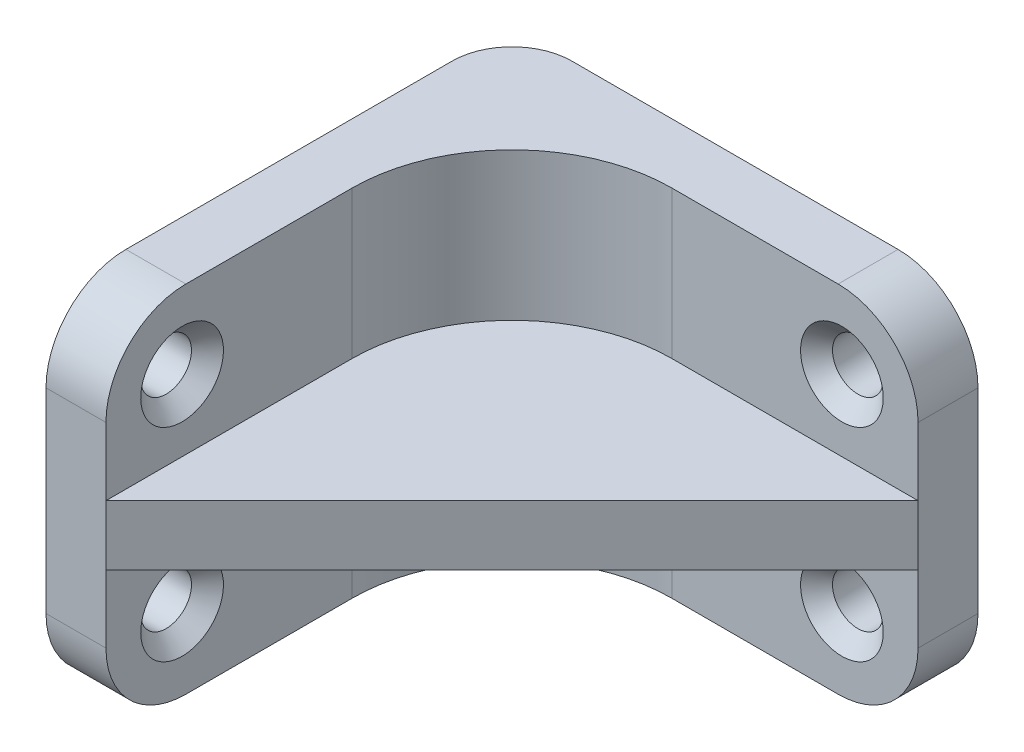
ISO-10303-21;
HEADER;
FILE_DESCRIPTION(('STEP AP214'),'2;1');
FILE_NAME('part.step','',(''),(''),'','','');
FILE_SCHEMA(('AUTOMOTIVE_DESIGN { 1 0 10303 214 1 1 1 1 }'));
ENDSEC;
DATA;
#1=APPLICATION_CONTEXT('core data for automotive mechanical design processes');
#2=APPLICATION_PROTOCOL_DEFINITION('international standard','automotive_design',2000,#1);
#3=PRODUCT_CONTEXT('',#1,'mechanical');
#4=PRODUCT('Part','Part','',(#3));
#5=PRODUCT_RELATED_PRODUCT_CATEGORY('part','',(#4));
#6=PRODUCT_DEFINITION_FORMATION('','',#4);
#7=PRODUCT_DEFINITION_CONTEXT('part definition',#1,'design');
#8=PRODUCT_DEFINITION('design','',#6,#7);
#9=PRODUCT_DEFINITION_SHAPE('','',#8);
#10=(LENGTH_UNIT() NAMED_UNIT(*) SI_UNIT(.MILLI.,.METRE.));
#11=(NAMED_UNIT(*) PLANE_ANGLE_UNIT() SI_UNIT($,.RADIAN.));
#12=(NAMED_UNIT(*) SI_UNIT($,.STERADIAN.) SOLID_ANGLE_UNIT());
#13=UNCERTAINTY_MEASURE_WITH_UNIT(LENGTH_MEASURE(1.E-05),#10,'distance_accuracy_value','');
#14=(GEOMETRIC_REPRESENTATION_CONTEXT(3) GLOBAL_UNCERTAINTY_ASSIGNED_CONTEXT((#13)) GLOBAL_UNIT_ASSIGNED_CONTEXT((#10,
#11,#12)) REPRESENTATION_CONTEXT('',''));
#15=CARTESIAN_POINT('',(0.,0.,0.));
#16=DIRECTION('',(0.,0.,1.));
#17=DIRECTION('',(1.,0.,0.));
#18=AXIS2_PLACEMENT_3D('',#15,#16,#17);
#19=CARTESIAN_POINT('',(-0.475,-0.474999999999998,7.5));
#20=DIRECTION('',(0.,0.,-1.));
#21=DIRECTION('',(-1.,0.,0.));
#22=AXIS2_PLACEMENT_3D('',#19,#20,#21);
#23=PLANE('',#22);
#24=CARTESIAN_POINT('',(0.,-25.4,7.5));
#25=DIRECTION('',(0.,0.,-1.));
#26=DIRECTION('',(-1.,0.,0.));
#27=AXIS2_PLACEMENT_3D('',#24,#25,#26);
#28=CIRCLE('',#27,5.17500000000001);
#29=CARTESIAN_POINT('',(-5.17500000000001,-25.4,7.5));
#30=VERTEX_POINT('',#29);
#31=EDGE_CURVE('E284',#30,#30,#28,.T.);
#32=ORIENTED_EDGE('',*,*,#31,.T.);
#33=EDGE_LOOP('',(#32));
#34=FACE_BOUND('',#33,.T.);
#35=DIRECTION('',(-1.,0.,0.));
#36=VECTOR('',#35,1.);
#37=CARTESIAN_POINT('',(-0.475000000000068,-16.45,7.5));
#38=LINE('',#37,#36);
#39=CARTESIAN_POINT('',(9.525,-16.45,7.5));
#40=VERTEX_POINT('',#39);
#41=CARTESIAN_POINT('',(-21.275,-16.45,7.5));
#42=VERTEX_POINT('',#41);
#43=EDGE_CURVE('E161',#40,#42,#38,.T.);
#44=ORIENTED_EDGE('',*,*,#43,.T.);
#45=DIRECTION('',(0.,-1.,0.));
#46=VECTOR('',#45,1.);
#47=CARTESIAN_POINT('',(-21.275,-0.475000000000001,7.5));
#48=LINE('',#47,#46);
#49=CARTESIAN_POINT('',(-21.275,-34.925,7.5));
#50=VERTEX_POINT('',#49);
#51=EDGE_CURVE('E147',#42,#50,#48,.T.);
#52=ORIENTED_EDGE('',*,*,#51,.T.);
#53=DIRECTION('',(1.,0.,0.));
#54=VECTOR('',#53,1.);
#55=CARTESIAN_POINT('',(-0.475000000000069,-34.925,7.5));
#56=LINE('',#55,#54);
#57=CARTESIAN_POINT('',(-0.475000000000067,-34.925,7.5));
#58=VERTEX_POINT('',#57);
#59=EDGE_CURVE('E239',#50,#58,#56,.T.);
#60=ORIENTED_EDGE('',*,*,#59,.T.);
#61=CARTESIAN_POINT('',(-0.474999999999998,-24.925,7.5));
#62=DIRECTION('',(0.,0.,1.));
#63=DIRECTION('',(-1.,0.,0.));
#64=AXIS2_PLACEMENT_3D('',#61,#62,#63);
#65=CIRCLE('',#64,10.);
#66=CARTESIAN_POINT('',(9.525,-24.9249999999999,7.5));
#67=VERTEX_POINT('',#66);
#68=EDGE_CURVE('E241',#58,#67,#65,.T.);
#69=ORIENTED_EDGE('',*,*,#68,.T.);
#70=DIRECTION('',(0.,1.,0.));
#71=VECTOR('',#70,1.);
#72=CARTESIAN_POINT('',(9.525,-0.475000000000069,7.5));
#73=LINE('',#72,#71);
#74=EDGE_CURVE('E162',#67,#40,#73,.T.);
#75=ORIENTED_EDGE('',*,*,#74,.T.);
#76=EDGE_LOOP('',(#44,#52,#60,#69,#75));
#77=FACE_BOUND('',#76,.T.);
#78=ADVANCED_FACE('F33',(#34,#77),#23,.F.);
#79=CARTESIAN_POINT('',(-41.275,-0.47500000000022,48.3));
#80=DIRECTION('',(1.,0.,0.));
#81=DIRECTION('',(0.,1.,0.));
#82=AXIS2_PLACEMENT_3D('',#79,#80,#81);
#83=PLANE('',#82);
#84=CARTESIAN_POINT('',(-41.275,-25.4,48.775));
#85=DIRECTION('',(1.,0.,0.));
#86=DIRECTION('',(0.,1.,0.));
#87=AXIS2_PLACEMENT_3D('',#84,#85,#86);
#88=CIRCLE('',#87,5.17500000000001);
#89=CARTESIAN_POINT('',(-41.275,-20.225,48.775));
#90=VERTEX_POINT('',#89);
#91=EDGE_CURVE('E41',#90,#90,#88,.F.);
#92=ORIENTED_EDGE('',*,*,#91,.T.);
#93=EDGE_LOOP('',(#92));
#94=FACE_BOUND('',#93,.T.);
#95=DIRECTION('',(0.,-1.,0.));
#96=VECTOR('',#95,1.);
#97=CARTESIAN_POINT('',(-41.275,-0.47500000000022,27.5));
#98=LINE('',#97,#96);
#99=CARTESIAN_POINT('',(-41.275,-34.925,27.5));
#100=VERTEX_POINT('',#99);
#101=CARTESIAN_POINT('',(-41.275,-16.45,27.5));
#102=VERTEX_POINT('',#101);
#103=EDGE_CURVE('E276',#100,#102,#98,.F.);
#104=ORIENTED_EDGE('',*,*,#103,.T.);
#105=DIRECTION('',(0.,0.,1.));
#106=VECTOR('',#105,1.);
#107=CARTESIAN_POINT('',(-41.275,-16.45,58.3000000000002));
#108=LINE('',#107,#106);
#109=CARTESIAN_POINT('',(-41.275,-16.45,58.3000000000002));
#110=VERTEX_POINT('',#109);
#111=EDGE_CURVE('E170',#102,#110,#108,.T.);
#112=ORIENTED_EDGE('',*,*,#111,.T.);
#113=DIRECTION('',(0.,1.,0.));
#114=VECTOR('',#113,1.);
#115=CARTESIAN_POINT('',(-41.275,-0.475000000000218,58.3000000000002));
#116=LINE('',#115,#114);
#117=CARTESIAN_POINT('',(-41.275,-24.925,58.3000000000002));
#118=VERTEX_POINT('',#117);
#119=EDGE_CURVE('E206',#118,#110,#116,.T.);
#120=ORIENTED_EDGE('',*,*,#119,.F.);
#121=CARTESIAN_POINT('',(-41.275,-24.925,48.3000000000002));
#122=DIRECTION('',(-1.,0.,0.));
#123=DIRECTION('',(0.,1.,0.));
#124=AXIS2_PLACEMENT_3D('',#121,#122,#123);
#125=CIRCLE('',#124,10.);
#126=CARTESIAN_POINT('',(-41.275,-34.925,48.3000000000002));
#127=VERTEX_POINT('',#126);
#128=EDGE_CURVE('E203',#127,#118,#125,.T.);
#129=ORIENTED_EDGE('',*,*,#128,.F.);
#130=DIRECTION('',(0.,0.,1.));
#131=VECTOR('',#130,1.);
#132=CARTESIAN_POINT('',(-41.275,-34.925,48.3000000000002));
#133=LINE('',#132,#131);
#134=EDGE_CURVE('E188',#100,#127,#133,.T.);
#135=ORIENTED_EDGE('',*,*,#134,.F.);
#136=EDGE_LOOP('',(#104,#112,#120,#129,#135));
#137=FACE_BOUND('',#136,.T.);
#138=ADVANCED_FACE('F301',(#94,#137),#83,.T.);
#139=CARTESIAN_POINT('',(-21.275,-0.475000000000001,27.5));
#140=DIRECTION('',(0.,-1.,0.));
#141=DIRECTION('',(1.,0.,0.));
#142=AXIS2_PLACEMENT_3D('',#139,#140,#141);
#143=CYLINDRICAL_SURFACE('',#142,20.);
#144=CARTESIAN_POINT('',(-21.275,-16.45,27.5));
#145=DIRECTION('',(0.,1.,0.));
#146=DIRECTION('',(-1.,0.,0.));
#147=AXIS2_PLACEMENT_3D('',#144,#145,#146);
#148=CIRCLE('',#147,20.);
#149=EDGE_CURVE('E152',#42,#102,#148,.T.);
#150=ORIENTED_EDGE('',*,*,#149,.T.);
#151=ORIENTED_EDGE('',*,*,#103,.F.);
#152=CARTESIAN_POINT('',(-21.275,-34.925,27.5));
#153=DIRECTION('',(0.,1.,0.));
#154=DIRECTION('',(0.,0.,1.));
#155=AXIS2_PLACEMENT_3D('',#152,#153,#154);
#156=CIRCLE('',#155,20.);
#157=EDGE_CURVE('E154',#50,#100,#156,.T.);
#158=ORIENTED_EDGE('',*,*,#157,.F.);
#159=ORIENTED_EDGE('',*,*,#51,.F.);
#160=EDGE_LOOP('',(#150,#151,#158,#159));
#161=FACE_BOUND('',#160,.T.);
#162=ADVANCED_FACE('F149',(#161),#143,.F.);
#163=CARTESIAN_POINT('',(0.,0.,7.5));
#164=DIRECTION('',(0.,0.,-1.));
#165=DIRECTION('',(-1.,0.,0.));
#166=AXIS2_PLACEMENT_3D('',#163,#164,#165);
#167=CIRCLE('',#166,5.17500000000001);
#168=CARTESIAN_POINT('',(-5.17500000000001,0.,7.5));
#169=VERTEX_POINT('',#168);
#170=EDGE_CURVE('E290',#169,#169,#167,.T.);
#171=ORIENTED_EDGE('',*,*,#170,.T.);
#172=EDGE_LOOP('',(#171));
#173=FACE_BOUND('',#172,.T.);
#174=CARTESIAN_POINT('',(-21.275,9.525,7.5));
#175=VERTEX_POINT('',#174);
#176=CARTESIAN_POINT('',(-21.275,-8.95,7.5));
#177=VERTEX_POINT('',#176);
#178=EDGE_CURVE('E157',#175,#177,#48,.T.);
#179=ORIENTED_EDGE('',*,*,#178,.T.);
#180=DIRECTION('',(-1.,0.,0.));
#181=VECTOR('',#180,1.);
#182=CARTESIAN_POINT('',(-21.275,-8.95,7.5));
#183=LINE('',#182,#181);
#184=CARTESIAN_POINT('',(9.525,-8.95,7.5));
#185=VERTEX_POINT('',#184);
#186=EDGE_CURVE('E48',#185,#177,#183,.T.);
#187=ORIENTED_EDGE('',*,*,#186,.F.);
#188=CARTESIAN_POINT('',(9.525,-0.475000000000068,7.5));
#189=VERTEX_POINT('',#188);
#190=EDGE_CURVE('E244',#185,#189,#73,.T.);
#191=ORIENTED_EDGE('',*,*,#190,.T.);
#192=CARTESIAN_POINT('',(-0.475,-0.474999999999998,7.5));
#193=DIRECTION('',(0.,0.,1.));
#194=DIRECTION('',(-1.,0.,0.));
#195=AXIS2_PLACEMENT_3D('',#192,#193,#194);
#196=CIRCLE('',#195,10.);
#197=CARTESIAN_POINT('',(-0.475000000000074,9.525,7.5));
#198=VERTEX_POINT('',#197);
#199=EDGE_CURVE('E246',#189,#198,#196,.T.);
#200=ORIENTED_EDGE('',*,*,#199,.T.);
#201=DIRECTION('',(-1.,0.,0.));
#202=VECTOR('',#201,1.);
#203=CARTESIAN_POINT('',(-41.275,9.525,7.5));
#204=LINE('',#203,#202);
#205=EDGE_CURVE('E248',#198,#175,#204,.T.);
#206=ORIENTED_EDGE('',*,*,#205,.T.);
#207=EDGE_LOOP('',(#179,#187,#191,#200,#206));
#208=FACE_BOUND('',#207,.T.);
#209=ADVANCED_FACE('F316',(#173,#208),#23,.F.);
#210=CARTESIAN_POINT('',(-0.475,-0.474999999999998,0.));
#211=DIRECTION('',(0.,0.,-1.));
#212=DIRECTION('',(-1.,0.,0.));
#213=AXIS2_PLACEMENT_3D('',#210,#211,#212);
#214=PLANE('',#213);
#215=CARTESIAN_POINT('',(0.,0.,0.));
#216=DIRECTION('',(0.,0.,1.));
#217=DIRECTION('',(1.,0.,0.));
#218=AXIS2_PLACEMENT_3D('',#215,#216,#217);
#219=CIRCLE('',#218,3.175);
#220=CARTESIAN_POINT('',(3.175,0.,0.));
#221=VERTEX_POINT('',#220);
#222=EDGE_CURVE('E235',#221,#221,#219,.T.);
#223=ORIENTED_EDGE('',*,*,#222,.T.);
#224=EDGE_LOOP('',(#223));
#225=FACE_BOUND('',#224,.T.);
#226=DIRECTION('',(1.,0.,0.));
#227=VECTOR('',#226,1.);
#228=CARTESIAN_POINT('',(-0.475000000000069,-34.925,0.));
#229=LINE('',#228,#227);
#230=CARTESIAN_POINT('',(-41.275,-34.925,0.));
#231=VERTEX_POINT('',#230);
#232=CARTESIAN_POINT('',(-0.475000000000067,-34.925,0.));
#233=VERTEX_POINT('',#232);
#234=EDGE_CURVE('E238',#231,#233,#229,.T.);
#235=ORIENTED_EDGE('',*,*,#234,.F.);
#236=DIRECTION('',(0.,-1.,0.));
#237=VECTOR('',#236,1.);
#238=CARTESIAN_POINT('',(-41.275,9.525,0.));
#239=LINE('',#238,#237);
#240=CARTESIAN_POINT('',(-41.275,9.52500000000001,0.));
#241=VERTEX_POINT('',#240);
#242=EDGE_CURVE('E242',#241,#231,#239,.T.);
#243=ORIENTED_EDGE('',*,*,#242,.F.);
#244=DIRECTION('',(-1.,0.,0.));
#245=VECTOR('',#244,1.);
#246=CARTESIAN_POINT('',(-41.275,9.525,0.));
#247=LINE('',#246,#245);
#248=CARTESIAN_POINT('',(-0.475000000000074,9.525,0.));
#249=VERTEX_POINT('',#248);
#250=EDGE_CURVE('E260',#249,#241,#247,.T.);
#251=ORIENTED_EDGE('',*,*,#250,.F.);
#252=CARTESIAN_POINT('',(-0.475,-0.474999999999998,0.));
#253=DIRECTION('',(0.,0.,1.));
#254=DIRECTION('',(-1.,0.,0.));
#255=AXIS2_PLACEMENT_3D('',#252,#253,#254);
#256=CIRCLE('',#255,10.);
#257=CARTESIAN_POINT('',(9.525,-0.475000000000068,0.));
#258=VERTEX_POINT('',#257);
#259=EDGE_CURVE('E258',#258,#249,#256,.T.);
#260=ORIENTED_EDGE('',*,*,#259,.F.);
#261=DIRECTION('',(0.,1.,0.));
#262=VECTOR('',#261,1.);
#263=CARTESIAN_POINT('',(9.525,-0.475000000000069,0.));
#264=LINE('',#263,#262);
#265=CARTESIAN_POINT('',(9.525,-24.9249999999999,0.));
#266=VERTEX_POINT('',#265);
#267=EDGE_CURVE('E256',#266,#258,#264,.T.);
#268=ORIENTED_EDGE('',*,*,#267,.F.);
#269=CARTESIAN_POINT('',(-0.474999999999998,-24.925,0.));
#270=DIRECTION('',(0.,0.,1.));
#271=DIRECTION('',(-1.,0.,0.));
#272=AXIS2_PLACEMENT_3D('',#269,#270,#271);
#273=CIRCLE('',#272,10.);
#274=EDGE_CURVE('E254',#233,#266,#273,.T.);
#275=ORIENTED_EDGE('',*,*,#274,.F.);
#276=EDGE_LOOP('',(#235,#243,#251,#260,#268,#275));
#277=FACE_BOUND('',#276,.T.);
#278=CARTESIAN_POINT('',(0.,-25.4,0.));
#279=DIRECTION('',(0.,0.,1.));
#280=DIRECTION('',(-1.,0.,0.));
#281=AXIS2_PLACEMENT_3D('',#278,#279,#280);
#282=CIRCLE('',#281,3.175);
#283=CARTESIAN_POINT('',(-3.175,-25.4,0.));
#284=VERTEX_POINT('',#283);
#285=EDGE_CURVE('E228',#284,#284,#282,.T.);
#286=ORIENTED_EDGE('',*,*,#285,.T.);
#287=EDGE_LOOP('',(#286));
#288=FACE_BOUND('',#287,.T.);
#289=ADVANCED_FACE('F325',(#225,#277,#288),#214,.T.);
#290=CARTESIAN_POINT('',(-0.475000000000069,-34.925,7.5));
#291=DIRECTION('',(0.,1.,0.));
#292=DIRECTION('',(0.,0.,1.));
#293=AXIS2_PLACEMENT_3D('',#290,#291,#292);
#294=PLANE('',#293);
#295=ORIENTED_EDGE('',*,*,#234,.T.);
#296=DIRECTION('',(0.,0.,-1.));
#297=VECTOR('',#296,1.);
#298=CARTESIAN_POINT('',(-0.475000000000067,-34.925,7.5));
#299=LINE('',#298,#297);
#300=EDGE_CURVE('E158',#58,#233,#299,.T.);
#301=ORIENTED_EDGE('',*,*,#300,.F.);
#302=ORIENTED_EDGE('',*,*,#59,.F.);
#303=ORIENTED_EDGE('',*,*,#157,.T.);
#304=ORIENTED_EDGE('',*,*,#134,.T.);
#305=DIRECTION('',(1.,0.,0.));
#306=VECTOR('',#305,1.);
#307=CARTESIAN_POINT('',(-48.775,-34.925,48.3000000000002));
#308=LINE('',#307,#306);
#309=CARTESIAN_POINT('',(-48.775,-34.925,48.3000000000002));
#310=VERTEX_POINT('',#309);
#311=EDGE_CURVE('E221',#310,#127,#308,.T.);
#312=ORIENTED_EDGE('',*,*,#311,.F.);
#313=DIRECTION('',(0.,0.,1.));
#314=VECTOR('',#313,1.);
#315=CARTESIAN_POINT('',(-48.775,-34.925,48.3000000000002));
#316=LINE('',#315,#314);
#317=CARTESIAN_POINT('',(-48.775,-34.925,7.50000000000001));
#318=VERTEX_POINT('',#317);
#319=EDGE_CURVE('E189',#318,#310,#316,.T.);
#320=ORIENTED_EDGE('',*,*,#319,.F.);
#321=CARTESIAN_POINT('',(-41.275,-34.925,7.5));
#322=DIRECTION('',(0.,-1.,0.));
#323=DIRECTION('',(0.,0.,-1.));
#324=AXIS2_PLACEMENT_3D('',#321,#322,#323);
#325=CIRCLE('',#324,7.5);
#326=EDGE_CURVE('E224',#318,#231,#325,.T.);
#327=ORIENTED_EDGE('',*,*,#326,.T.);
#328=EDGE_LOOP('',(#295,#301,#302,#303,#304,#312,#320,#327));
#329=FACE_BOUND('',#328,.T.);
#330=ADVANCED_FACE('F331',(#329),#294,.F.);
#331=CARTESIAN_POINT('',(-0.474999999999998,-24.925,7.5));
#332=DIRECTION('',(0.,0.,-1.));
#333=DIRECTION('',(-1.,0.,0.));
#334=AXIS2_PLACEMENT_3D('',#331,#332,#333);
#335=CYLINDRICAL_SURFACE('',#334,10.);
#336=ORIENTED_EDGE('',*,*,#274,.T.);
#337=DIRECTION('',(0.,0.,-1.));
#338=VECTOR('',#337,1.);
#339=CARTESIAN_POINT('',(9.525,-24.9249999999999,7.5));
#340=LINE('',#339,#338);
#341=EDGE_CURVE('E270',#67,#266,#340,.T.);
#342=ORIENTED_EDGE('',*,*,#341,.F.);
#343=ORIENTED_EDGE('',*,*,#68,.F.);
#344=ORIENTED_EDGE('',*,*,#300,.T.);
#345=EDGE_LOOP('',(#336,#342,#343,#344));
#346=FACE_BOUND('',#345,.T.);
#347=ADVANCED_FACE('F370',(#346),#335,.T.);
#348=CARTESIAN_POINT('',(9.525,-0.475000000000069,7.5));
#349=DIRECTION('',(-1.,0.,0.));
#350=DIRECTION('',(0.,-1.,0.));
#351=AXIS2_PLACEMENT_3D('',#348,#349,#350);
#352=PLANE('',#351);
#353=ORIENTED_EDGE('',*,*,#267,.T.);
#354=DIRECTION('',(0.,0.,-1.));
#355=VECTOR('',#354,1.);
#356=CARTESIAN_POINT('',(9.525,-0.475000000000068,7.5));
#357=LINE('',#356,#355);
#358=EDGE_CURVE('E267',#189,#258,#357,.T.);
#359=ORIENTED_EDGE('',*,*,#358,.F.);
#360=ORIENTED_EDGE('',*,*,#190,.F.);
#361=DIRECTION('',(0.,-1.,0.));
#362=VECTOR('',#361,1.);
#363=CARTESIAN_POINT('',(9.525,-8.95,7.5));
#364=LINE('',#363,#362);
#365=EDGE_CURVE('E55',#185,#40,#364,.T.);
#366=ORIENTED_EDGE('',*,*,#365,.T.);
#367=ORIENTED_EDGE('',*,*,#74,.F.);
#368=ORIENTED_EDGE('',*,*,#341,.T.);
#369=EDGE_LOOP('',(#353,#359,#360,#366,#367,#368));
#370=FACE_BOUND('',#369,.T.);
#371=ADVANCED_FACE('F372',(#370),#352,.F.);
#372=CARTESIAN_POINT('',(-0.475,-0.474999999999998,7.5));
#373=DIRECTION('',(0.,0.,-1.));
#374=DIRECTION('',(-1.,0.,0.));
#375=AXIS2_PLACEMENT_3D('',#372,#373,#374);
#376=CYLINDRICAL_SURFACE('',#375,10.);
#377=ORIENTED_EDGE('',*,*,#259,.T.);
#378=DIRECTION('',(0.,0.,-1.));
#379=VECTOR('',#378,1.);
#380=CARTESIAN_POINT('',(-0.475000000000074,9.525,7.5));
#381=LINE('',#380,#379);
#382=EDGE_CURVE('E251',#198,#249,#381,.T.);
#383=ORIENTED_EDGE('',*,*,#382,.F.);
#384=ORIENTED_EDGE('',*,*,#199,.F.);
#385=ORIENTED_EDGE('',*,*,#358,.T.);
#386=EDGE_LOOP('',(#377,#383,#384,#385));
#387=FACE_BOUND('',#386,.T.);
#388=ADVANCED_FACE('F375',(#387),#376,.T.);
#389=CARTESIAN_POINT('',(-41.275,9.525,7.5));
#390=DIRECTION('',(0.,-1.,0.));
#391=DIRECTION('',(1.,0.,0.));
#392=AXIS2_PLACEMENT_3D('',#389,#390,#391);
#393=PLANE('',#392);
#394=ORIENTED_EDGE('',*,*,#250,.T.);
#395=CARTESIAN_POINT('',(-41.275,9.52500000000001,7.5));
#396=DIRECTION('',(0.,-1.,0.));
#397=DIRECTION('',(1.,0.,0.));
#398=AXIS2_PLACEMENT_3D('',#395,#396,#397);
#399=CIRCLE('',#398,7.5);
#400=CARTESIAN_POINT('',(-48.775,9.52500000000001,7.5));
#401=VERTEX_POINT('',#400);
#402=EDGE_CURVE('E225',#241,#401,#399,.F.);
#403=ORIENTED_EDGE('',*,*,#402,.T.);
#404=DIRECTION('',(0.,0.,-1.));
#405=VECTOR('',#404,1.);
#406=CARTESIAN_POINT('',(-48.775,9.52500000000001,7.5));
#407=LINE('',#406,#405);
#408=CARTESIAN_POINT('',(-48.775,9.52500000000001,48.3));
#409=VERTEX_POINT('',#408);
#410=EDGE_CURVE('E199',#409,#401,#407,.T.);
#411=ORIENTED_EDGE('',*,*,#410,.F.);
#412=DIRECTION('',(1.,0.,0.));
#413=VECTOR('',#412,1.);
#414=CARTESIAN_POINT('',(-48.775,9.52500000000001,48.3));
#415=LINE('',#414,#413);
#416=CARTESIAN_POINT('',(-41.275,9.52500000000001,48.3));
#417=VERTEX_POINT('',#416);
#418=EDGE_CURVE('E201',#409,#417,#415,.T.);
#419=ORIENTED_EDGE('',*,*,#418,.T.);
#420=DIRECTION('',(0.,0.,-1.));
#421=VECTOR('',#420,1.);
#422=CARTESIAN_POINT('',(-41.275,9.52500000000001,7.5));
#423=LINE('',#422,#421);
#424=CARTESIAN_POINT('',(-41.275,9.52500000000001,27.5));
#425=VERTEX_POINT('',#424);
#426=EDGE_CURVE('E193',#417,#425,#423,.T.);
#427=ORIENTED_EDGE('',*,*,#426,.T.);
#428=CARTESIAN_POINT('',(-21.275,9.525,27.5));
#429=DIRECTION('',(0.,-1.,0.));
#430=DIRECTION('',(1.,0.,0.));
#431=AXIS2_PLACEMENT_3D('',#428,#429,#430);
#432=CIRCLE('',#431,20.);
#433=EDGE_CURVE('E279',#425,#175,#432,.T.);
#434=ORIENTED_EDGE('',*,*,#433,.T.);
#435=ORIENTED_EDGE('',*,*,#205,.F.);
#436=ORIENTED_EDGE('',*,*,#382,.T.);
#437=EDGE_LOOP('',(#394,#403,#411,#419,#427,#434,#435,#436));
#438=FACE_BOUND('',#437,.T.);
#439=ADVANCED_FACE('F381',(#438),#393,.F.);
#440=CARTESIAN_POINT('',(0.,0.,7.5));
#441=DIRECTION('',(0.,0.,-1.));
#442=DIRECTION('',(-1.,0.,0.));
#443=AXIS2_PLACEMENT_3D('',#440,#441,#442);
#444=CYLINDRICAL_SURFACE('',#443,3.175);
#445=CARTESIAN_POINT('',(0.,0.,5.49999999999999));
#446=DIRECTION('',(0.,0.,-1.));
#447=DIRECTION('',(-1.,0.,0.));
#448=AXIS2_PLACEMENT_3D('',#445,#446,#447);
#449=CIRCLE('',#448,3.175);
#450=CARTESIAN_POINT('',(-3.175,0.,5.49999999999999));
#451=VERTEX_POINT('',#450);
#452=EDGE_CURVE('E287',#451,#451,#449,.F.);
#453=ORIENTED_EDGE('',*,*,#452,.T.);
#454=EDGE_LOOP('',(#453));
#455=FACE_BOUND('',#454,.T.);
#456=ORIENTED_EDGE('',*,*,#222,.F.);
#457=EDGE_LOOP('',(#456));
#458=FACE_BOUND('',#457,.T.);
#459=ADVANCED_FACE('F402',(#455,#458),#444,.F.);
#460=CARTESIAN_POINT('',(0.,-25.4,7.5));
#461=DIRECTION('',(0.,0.,-1.));
#462=DIRECTION('',(-1.,0.,0.));
#463=AXIS2_PLACEMENT_3D('',#460,#461,#462);
#464=CYLINDRICAL_SURFACE('',#463,3.175);
#465=CARTESIAN_POINT('',(0.,-25.4,5.49999999999999));
#466=DIRECTION('',(0.,0.,-1.));
#467=DIRECTION('',(-1.,0.,0.));
#468=AXIS2_PLACEMENT_3D('',#465,#466,#467);
#469=CIRCLE('',#468,3.175);
#470=CARTESIAN_POINT('',(-3.175,-25.4,5.49999999999999));
#471=VERTEX_POINT('',#470);
#472=EDGE_CURVE('E281',#471,#471,#469,.F.);
#473=ORIENTED_EDGE('',*,*,#472,.T.);
#474=EDGE_LOOP('',(#473));
#475=FACE_BOUND('',#474,.T.);
#476=ORIENTED_EDGE('',*,*,#285,.F.);
#477=EDGE_LOOP('',(#476));
#478=FACE_BOUND('',#477,.T.);
#479=ADVANCED_FACE('F405',(#475,#478),#464,.F.);
#480=CARTESIAN_POINT('',(-41.275,20.1316017177982,7.5));
#481=DIRECTION('',(0.,-1.,0.));
#482=DIRECTION('',(0.,0.,-1.));
#483=AXIS2_PLACEMENT_3D('',#480,#481,#482);
#484=CYLINDRICAL_SURFACE('',#483,7.5);
#485=ORIENTED_EDGE('',*,*,#402,.F.);
#486=ORIENTED_EDGE('',*,*,#242,.T.);
#487=ORIENTED_EDGE('',*,*,#326,.F.);
#488=DIRECTION('',(0.,-1.,0.));
#489=VECTOR('',#488,1.);
#490=CARTESIAN_POINT('',(-48.775,20.1316017177982,7.50000000000001));
#491=LINE('',#490,#489);
#492=EDGE_CURVE('E229',#401,#318,#491,.T.);
#493=ORIENTED_EDGE('',*,*,#492,.F.);
#494=EDGE_LOOP('',(#485,#486,#487,#493));
#495=FACE_BOUND('',#494,.T.);
#496=ADVANCED_FACE('F412',(#495),#484,.T.);
#497=CARTESIAN_POINT('',(-48.775,-0.475000000000221,48.3));
#498=DIRECTION('',(1.,0.,0.));
#499=DIRECTION('',(0.,1.,0.));
#500=AXIS2_PLACEMENT_3D('',#497,#498,#499);
#501=PLANE('',#500);
#502=ORIENTED_EDGE('',*,*,#319,.T.);
#503=CARTESIAN_POINT('',(-48.775,-24.925,48.3000000000002));
#504=DIRECTION('',(-1.,0.,0.));
#505=DIRECTION('',(0.,1.,0.));
#506=AXIS2_PLACEMENT_3D('',#503,#504,#505);
#507=CIRCLE('',#506,10.);
#508=CARTESIAN_POINT('',(-48.775,-24.925,58.3000000000002));
#509=VERTEX_POINT('',#508);
#510=EDGE_CURVE('E192',#310,#509,#507,.T.);
#511=ORIENTED_EDGE('',*,*,#510,.T.);
#512=DIRECTION('',(0.,1.,0.));
#513=VECTOR('',#512,1.);
#514=CARTESIAN_POINT('',(-48.775,-0.475000000000219,58.3000000000002));
#515=LINE('',#514,#513);
#516=CARTESIAN_POINT('',(-48.775,-0.475000000000218,58.3000000000002));
#517=VERTEX_POINT('',#516);
#518=EDGE_CURVE('E195',#509,#517,#515,.T.);
#519=ORIENTED_EDGE('',*,*,#518,.T.);
#520=CARTESIAN_POINT('',(-48.775,-0.475000000000221,48.3));
#521=DIRECTION('',(-1.,0.,0.));
#522=DIRECTION('',(0.,1.,0.));
#523=AXIS2_PLACEMENT_3D('',#520,#521,#522);
#524=CIRCLE('',#523,10.0000000000002);
#525=EDGE_CURVE('E197',#517,#409,#524,.T.);
#526=ORIENTED_EDGE('',*,*,#525,.T.);
#527=ORIENTED_EDGE('',*,*,#410,.T.);
#528=ORIENTED_EDGE('',*,*,#492,.T.);
#529=EDGE_LOOP('',(#502,#511,#519,#526,#527,#528));
#530=FACE_BOUND('',#529,.T.);
#531=CARTESIAN_POINT('',(-48.775,0.,48.775));
#532=DIRECTION('',(-1.,0.,0.));
#533=DIRECTION('',(0.,-1.,0.));
#534=AXIS2_PLACEMENT_3D('',#531,#532,#533);
#535=CIRCLE('',#534,3.17500000000001);
#536=CARTESIAN_POINT('',(-48.775,-3.175,48.775));
#537=VERTEX_POINT('',#536);
#538=EDGE_CURVE('E185',#537,#537,#535,.T.);
#539=ORIENTED_EDGE('',*,*,#538,.F.);
#540=EDGE_LOOP('',(#539));
#541=FACE_BOUND('',#540,.T.);
#542=CARTESIAN_POINT('',(-48.775,-25.4,48.775));
#543=DIRECTION('',(-1.,0.,0.));
#544=DIRECTION('',(0.,1.,0.));
#545=AXIS2_PLACEMENT_3D('',#542,#543,#544);
#546=CIRCLE('',#545,3.175);
#547=CARTESIAN_POINT('',(-48.775,-22.225,48.775));
#548=VERTEX_POINT('',#547);
#549=EDGE_CURVE('E182',#548,#548,#546,.T.);
#550=ORIENTED_EDGE('',*,*,#549,.F.);
#551=EDGE_LOOP('',(#550));
#552=FACE_BOUND('',#551,.T.);
#553=ADVANCED_FACE('F418',(#530,#541,#552),#501,.F.);
#554=CARTESIAN_POINT('',(-41.275,0.,48.775));
#555=DIRECTION('',(1.,0.,0.));
#556=DIRECTION('',(0.,1.,0.));
#557=AXIS2_PLACEMENT_3D('',#554,#555,#556);
#558=CIRCLE('',#557,5.17499999999998);
#559=CARTESIAN_POINT('',(-41.275,5.17499999999999,48.775));
#560=VERTEX_POINT('',#559);
#561=EDGE_CURVE('E293',#560,#560,#558,.F.);
#562=ORIENTED_EDGE('',*,*,#561,.T.);
#563=EDGE_LOOP('',(#562));
#564=FACE_BOUND('',#563,.T.);
#565=DIRECTION('',(0.,0.,1.));
#566=VECTOR('',#565,1.);
#567=CARTESIAN_POINT('',(-41.275,-8.95,27.5));
#568=LINE('',#567,#566);
#569=CARTESIAN_POINT('',(-41.275,-8.95,27.5));
#570=VERTEX_POINT('',#569);
#571=CARTESIAN_POINT('',(-41.275,-8.95,58.3000000000002));
#572=VERTEX_POINT('',#571);
#573=EDGE_CURVE('E348',#570,#572,#568,.T.);
#574=ORIENTED_EDGE('',*,*,#573,.F.);
#575=EDGE_CURVE('E275',#570,#425,#98,.F.);
#576=ORIENTED_EDGE('',*,*,#575,.T.);
#577=ORIENTED_EDGE('',*,*,#426,.F.);
#578=CARTESIAN_POINT('',(-41.275,-0.47500000000022,48.3));
#579=DIRECTION('',(-1.,0.,0.));
#580=DIRECTION('',(0.,1.,0.));
#581=AXIS2_PLACEMENT_3D('',#578,#579,#580);
#582=CIRCLE('',#581,10.0000000000002);
#583=CARTESIAN_POINT('',(-41.275,-0.475000000000217,58.3000000000002));
#584=VERTEX_POINT('',#583);
#585=EDGE_CURVE('E209',#584,#417,#582,.T.);
#586=ORIENTED_EDGE('',*,*,#585,.F.);
#587=EDGE_CURVE('E205',#572,#584,#116,.T.);
#588=ORIENTED_EDGE('',*,*,#587,.F.);
#589=EDGE_LOOP('',(#574,#576,#577,#586,#588));
#590=FACE_BOUND('',#589,.T.);
#591=ADVANCED_FACE('F321',(#564,#590),#83,.T.);
#592=CARTESIAN_POINT('',(-48.775,-24.925,48.3000000000002));
#593=DIRECTION('',(1.,0.,0.));
#594=DIRECTION('',(0.,1.,0.));
#595=AXIS2_PLACEMENT_3D('',#592,#593,#594);
#596=CYLINDRICAL_SURFACE('',#595,10.);
#597=ORIENTED_EDGE('',*,*,#128,.T.);
#598=DIRECTION('',(1.,0.,0.));
#599=VECTOR('',#598,1.);
#600=CARTESIAN_POINT('',(-48.775,-24.925,58.3000000000002));
#601=LINE('',#600,#599);
#602=EDGE_CURVE('E218',#509,#118,#601,.T.);
#603=ORIENTED_EDGE('',*,*,#602,.F.);
#604=ORIENTED_EDGE('',*,*,#510,.F.);
#605=ORIENTED_EDGE('',*,*,#311,.T.);
#606=EDGE_LOOP('',(#597,#603,#604,#605));
#607=FACE_BOUND('',#606,.T.);
#608=ADVANCED_FACE('F422',(#607),#596,.T.);
#609=CARTESIAN_POINT('',(-48.775,-0.475000000000219,58.3000000000002));
#610=DIRECTION('',(0.,0.,-1.));
#611=DIRECTION('',(-1.,0.,0.));
#612=AXIS2_PLACEMENT_3D('',#609,#610,#611);
#613=PLANE('',#612);
#614=ORIENTED_EDGE('',*,*,#119,.T.);
#615=DIRECTION('',(0.,-1.,0.));
#616=VECTOR('',#615,1.);
#617=CARTESIAN_POINT('',(-41.275,-8.95,58.3000000000002));
#618=LINE('',#617,#616);
#619=EDGE_CURVE('E179',#572,#110,#618,.T.);
#620=ORIENTED_EDGE('',*,*,#619,.F.);
#621=ORIENTED_EDGE('',*,*,#587,.T.);
#622=DIRECTION('',(1.,0.,0.));
#623=VECTOR('',#622,1.);
#624=CARTESIAN_POINT('',(-48.775,-0.475000000000218,58.3000000000002));
#625=LINE('',#624,#623);
#626=EDGE_CURVE('E215',#517,#584,#625,.T.);
#627=ORIENTED_EDGE('',*,*,#626,.F.);
#628=ORIENTED_EDGE('',*,*,#518,.F.);
#629=ORIENTED_EDGE('',*,*,#602,.T.);
#630=EDGE_LOOP('',(#614,#620,#621,#627,#628,#629));
#631=FACE_BOUND('',#630,.T.);
#632=ADVANCED_FACE('F356',(#631),#613,.F.);
#633=CARTESIAN_POINT('',(-48.775,-0.475000000000221,48.3));
#634=DIRECTION('',(1.,0.,0.));
#635=DIRECTION('',(0.,1.,0.));
#636=AXIS2_PLACEMENT_3D('',#633,#634,#635);
#637=CYLINDRICAL_SURFACE('',#636,10.0000000000002);
#638=ORIENTED_EDGE('',*,*,#585,.T.);
#639=ORIENTED_EDGE('',*,*,#418,.F.);
#640=ORIENTED_EDGE('',*,*,#525,.F.);
#641=ORIENTED_EDGE('',*,*,#626,.T.);
#642=EDGE_LOOP('',(#638,#639,#640,#641));
#643=FACE_BOUND('',#642,.T.);
#644=ADVANCED_FACE('F428',(#643),#637,.T.);
#645=CARTESIAN_POINT('',(-48.775,0.,48.775));
#646=DIRECTION('',(1.,0.,0.));
#647=DIRECTION('',(0.,1.,0.));
#648=AXIS2_PLACEMENT_3D('',#645,#646,#647);
#649=CYLINDRICAL_SURFACE('',#648,3.17500000000001);
#650=CARTESIAN_POINT('',(-43.275,0.,48.775));
#651=DIRECTION('',(1.,0.,0.));
#652=DIRECTION('',(0.,1.,0.));
#653=AXIS2_PLACEMENT_3D('',#650,#651,#652);
#654=CIRCLE('',#653,3.17500000000001);
#655=CARTESIAN_POINT('',(-43.275,3.17500000000001,48.775));
#656=VERTEX_POINT('',#655);
#657=EDGE_CURVE('E296',#656,#656,#654,.T.);
#658=ORIENTED_EDGE('',*,*,#657,.T.);
#659=EDGE_LOOP('',(#658));
#660=FACE_BOUND('',#659,.T.);
#661=ORIENTED_EDGE('',*,*,#538,.T.);
#662=EDGE_LOOP('',(#661));
#663=FACE_BOUND('',#662,.T.);
#664=ADVANCED_FACE('F430',(#660,#663),#649,.F.);
#665=CARTESIAN_POINT('',(-48.775,-25.4,48.775));
#666=DIRECTION('',(1.,0.,0.));
#667=DIRECTION('',(0.,1.,0.));
#668=AXIS2_PLACEMENT_3D('',#665,#666,#667);
#669=CYLINDRICAL_SURFACE('',#668,3.175);
#670=CARTESIAN_POINT('',(-43.275,-25.4,48.775));
#671=DIRECTION('',(1.,0.,0.));
#672=DIRECTION('',(0.,0.,-1.));
#673=AXIS2_PLACEMENT_3D('',#670,#671,#672);
#674=CIRCLE('',#673,3.175);
#675=CARTESIAN_POINT('',(-43.275,-25.4,45.6));
#676=VERTEX_POINT('',#675);
#677=EDGE_CURVE('E11',#676,#676,#674,.T.);
#678=ORIENTED_EDGE('',*,*,#677,.T.);
#679=EDGE_LOOP('',(#678));
#680=FACE_BOUND('',#679,.T.);
#681=ORIENTED_EDGE('',*,*,#549,.T.);
#682=EDGE_LOOP('',(#681));
#683=FACE_BOUND('',#682,.T.);
#684=ADVANCED_FACE('F390',(#680,#683),#669,.F.);
#685=ORIENTED_EDGE('',*,*,#575,.F.);
#686=CARTESIAN_POINT('',(-21.275,-8.95,27.5));
#687=DIRECTION('',(0.,1.,0.));
#688=DIRECTION('',(-1.,0.,0.));
#689=AXIS2_PLACEMENT_3D('',#686,#687,#688);
#690=CIRCLE('',#689,20.);
#691=EDGE_CURVE('E345',#177,#570,#690,.T.);
#692=ORIENTED_EDGE('',*,*,#691,.F.);
#693=ORIENTED_EDGE('',*,*,#178,.F.);
#694=ORIENTED_EDGE('',*,*,#433,.F.);
#695=EDGE_LOOP('',(#685,#692,#693,#694));
#696=FACE_BOUND('',#695,.T.);
#697=ADVANCED_FACE('F334',(#696),#143,.F.);
#698=CARTESIAN_POINT('',(-41.275,-8.95,58.3000000000002));
#699=DIRECTION('',(-0.707106781186549,0.,-0.707106781186546));
#700=DIRECTION('',(-0.707106781186546,0.,0.707106781186549));
#701=AXIS2_PLACEMENT_3D('',#698,#699,#700);
#702=PLANE('',#701);
#703=DIRECTION('',(0.707106781186546,0.,-0.707106781186549));
#704=VECTOR('',#703,1.);
#705=CARTESIAN_POINT('',(-41.275,-16.45,58.3000000000002));
#706=LINE('',#705,#704);
#707=EDGE_CURVE('E166',#110,#40,#706,.T.);
#708=ORIENTED_EDGE('',*,*,#707,.T.);
#709=ORIENTED_EDGE('',*,*,#365,.F.);
#710=DIRECTION('',(0.707106781186546,0.,-0.707106781186549));
#711=VECTOR('',#710,1.);
#712=CARTESIAN_POINT('',(-41.275,-8.95,58.3000000000002));
#713=LINE('',#712,#711);
#714=EDGE_CURVE('E174',#572,#185,#713,.T.);
#715=ORIENTED_EDGE('',*,*,#714,.F.);
#716=ORIENTED_EDGE('',*,*,#619,.T.);
#717=EDGE_LOOP('',(#708,#709,#715,#716));
#718=FACE_BOUND('',#717,.T.);
#719=ADVANCED_FACE('F353',(#718),#702,.F.);
#720=CARTESIAN_POINT('',(-21.275,-8.95,27.5));
#721=DIRECTION('',(0.,1.,0.));
#722=DIRECTION('',(-1.,0.,0.));
#723=AXIS2_PLACEMENT_3D('',#720,#721,#722);
#724=PLANE('',#723);
#725=ORIENTED_EDGE('',*,*,#186,.T.);
#726=ORIENTED_EDGE('',*,*,#691,.T.);
#727=ORIENTED_EDGE('',*,*,#573,.T.);
#728=ORIENTED_EDGE('',*,*,#714,.T.);
#729=EDGE_LOOP('',(#725,#726,#727,#728));
#730=FACE_BOUND('',#729,.T.);
#731=ADVANCED_FACE('F343',(#730),#724,.T.);
#732=CARTESIAN_POINT('',(-21.275,-16.45,27.5));
#733=DIRECTION('',(0.,1.,0.));
#734=DIRECTION('',(-1.,0.,0.));
#735=AXIS2_PLACEMENT_3D('',#732,#733,#734);
#736=PLANE('',#735);
#737=ORIENTED_EDGE('',*,*,#149,.F.);
#738=ORIENTED_EDGE('',*,*,#43,.F.);
#739=ORIENTED_EDGE('',*,*,#707,.F.);
#740=ORIENTED_EDGE('',*,*,#111,.F.);
#741=EDGE_LOOP('',(#737,#738,#739,#740));
#742=FACE_BOUND('',#741,.T.);
#743=ADVANCED_FACE('F169',(#742),#736,.F.);
#744=CARTESIAN_POINT('',(0.,-25.4,5.49999999999999));
#745=DIRECTION('',(0.,0.,1.));
#746=DIRECTION('',(1.,0.,0.));
#747=AXIS2_PLACEMENT_3D('',#744,#745,#746);
#748=CONICAL_SURFACE('',#747,3.175,0.785398163397449);
#749=ORIENTED_EDGE('',*,*,#31,.F.);
#750=EDGE_LOOP('',(#749));
#751=FACE_BOUND('',#750,.T.);
#752=ORIENTED_EDGE('',*,*,#472,.F.);
#753=EDGE_LOOP('',(#752));
#754=FACE_BOUND('',#753,.T.);
#755=ADVANCED_FACE('F391',(#751,#754),#748,.F.);
#756=CARTESIAN_POINT('',(0.,0.,5.49999999999999));
#757=DIRECTION('',(0.,0.,1.));
#758=DIRECTION('',(1.,0.,0.));
#759=AXIS2_PLACEMENT_3D('',#756,#757,#758);
#760=CONICAL_SURFACE('',#759,3.175,0.785398163397449);
#761=ORIENTED_EDGE('',*,*,#170,.F.);
#762=EDGE_LOOP('',(#761));
#763=FACE_BOUND('',#762,.T.);
#764=ORIENTED_EDGE('',*,*,#452,.F.);
#765=EDGE_LOOP('',(#764));
#766=FACE_BOUND('',#765,.T.);
#767=ADVANCED_FACE('F310',(#763,#766),#760,.F.);
#768=CARTESIAN_POINT('',(-41.275,0.,48.775));
#769=DIRECTION('',(1.,0.,0.));
#770=DIRECTION('',(0.,1.,0.));
#771=AXIS2_PLACEMENT_3D('',#768,#769,#770);
#772=CONICAL_SURFACE('',#771,5.17499999999998,0.785398163397445);
#773=ORIENTED_EDGE('',*,*,#657,.F.);
#774=EDGE_LOOP('',(#773));
#775=FACE_BOUND('',#774,.T.);
#776=ORIENTED_EDGE('',*,*,#561,.F.);
#777=EDGE_LOOP('',(#776));
#778=FACE_BOUND('',#777,.T.);
#779=ADVANCED_FACE('F305',(#775,#778),#772,.F.);
#780=CARTESIAN_POINT('',(-41.275,-25.4,48.775));
#781=DIRECTION('',(1.,0.,0.));
#782=DIRECTION('',(0.,0.,-1.));
#783=AXIS2_PLACEMENT_3D('',#780,#781,#782);
#784=CONICAL_SURFACE('',#783,5.17500000000001,0.785398163397448);
#785=ORIENTED_EDGE('',*,*,#677,.F.);
#786=EDGE_LOOP('',(#785));
#787=FACE_BOUND('',#786,.T.);
#788=ORIENTED_EDGE('',*,*,#91,.F.);
#789=EDGE_LOOP('',(#788));
#790=FACE_BOUND('',#789,.T.);
#791=ADVANCED_FACE('F35',(#787,#790),#784,.F.);
#792=CLOSED_SHELL('',(#78,#138,#162,#209,#289,#330,#347,#371,#388,#439,#459,#479,#496,#553,#591,
#608,#632,#644,#664,#684,#697,#719,#731,#743,#755,#767,#779,#791));
#793=MANIFOLD_SOLID_BREP('B2',#792);
#794=ADVANCED_BREP_SHAPE_REPRESENTATION('',(#18,#793),#14);
#795=SHAPE_DEFINITION_REPRESENTATION(#9,#794);
ENDSEC;
END-ISO-10303-21;
